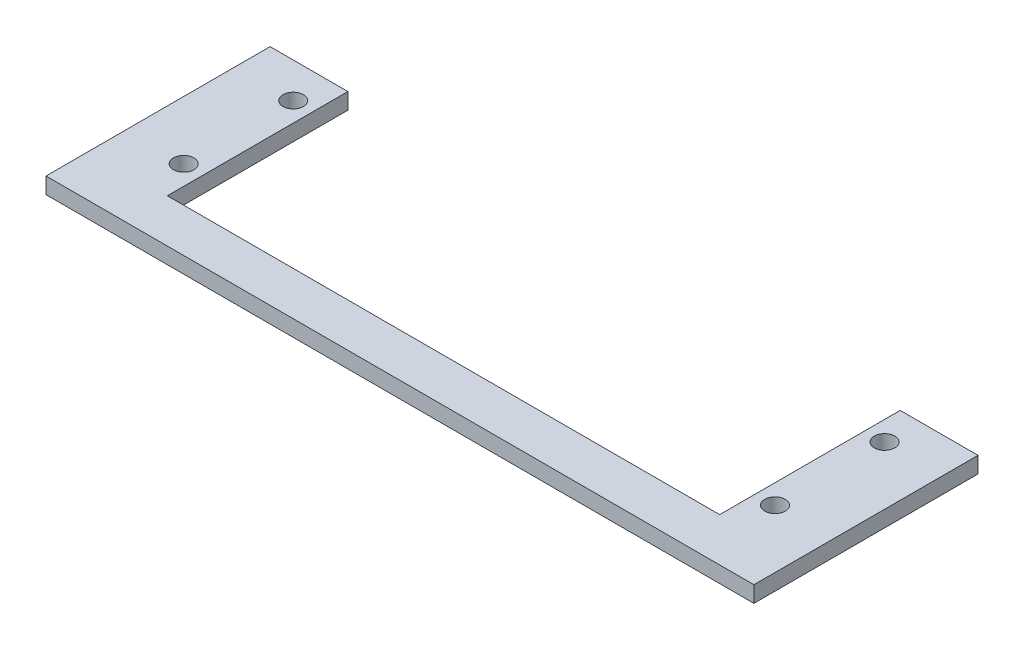
ISO-10303-21;
HEADER;
FILE_DESCRIPTION(('STEP AP214'),'2;1');
FILE_NAME('part.step','',(''),(''),'','','');
FILE_SCHEMA(('AUTOMOTIVE_DESIGN { 1 0 10303 214 1 1 1 1 }'));
ENDSEC;
DATA;
#1=APPLICATION_CONTEXT('core data for automotive mechanical design processes');
#2=APPLICATION_PROTOCOL_DEFINITION('international standard','automotive_design',2000,#1);
#3=PRODUCT_CONTEXT('',#1,'mechanical');
#4=PRODUCT('Part','Part','',(#3));
#5=PRODUCT_RELATED_PRODUCT_CATEGORY('part','',(#4));
#6=PRODUCT_DEFINITION_FORMATION('','',#4);
#7=PRODUCT_DEFINITION_CONTEXT('part definition',#1,'design');
#8=PRODUCT_DEFINITION('design','',#6,#7);
#9=PRODUCT_DEFINITION_SHAPE('','',#8);
#10=(LENGTH_UNIT() NAMED_UNIT(*) SI_UNIT(.MILLI.,.METRE.));
#11=(NAMED_UNIT(*) PLANE_ANGLE_UNIT() SI_UNIT($,.RADIAN.));
#12=(NAMED_UNIT(*) SI_UNIT($,.STERADIAN.) SOLID_ANGLE_UNIT());
#13=UNCERTAINTY_MEASURE_WITH_UNIT(LENGTH_MEASURE(1.E-05),#10,'distance_accuracy_value','');
#14=(GEOMETRIC_REPRESENTATION_CONTEXT(3) GLOBAL_UNCERTAINTY_ASSIGNED_CONTEXT((#13)) GLOBAL_UNIT_ASSIGNED_CONTEXT((#10,
#11,#12)) REPRESENTATION_CONTEXT('',''));
#15=CARTESIAN_POINT('',(0.,0.,0.));
#16=DIRECTION('',(0.,0.,1.));
#17=DIRECTION('',(1.,0.,0.));
#18=AXIS2_PLACEMENT_3D('',#15,#16,#17);
#19=CARTESIAN_POINT('',(0.,2.6,0.));
#20=DIRECTION('',(0.,1.,0.));
#21=DIRECTION('',(0.,0.,1.));
#22=AXIS2_PLACEMENT_3D('',#19,#20,#21);
#23=PLANE('',#22);
#24=CARTESIAN_POINT('',(47.5,2.6,5.64999999999998));
#25=DIRECTION('',(0.,1.,0.));
#26=DIRECTION('',(0.,0.,1.));
#27=AXIS2_PLACEMENT_3D('',#24,#25,#26);
#28=CIRCLE('',#27,1.65);
#29=CARTESIAN_POINT('',(47.5,2.6,7.29999999999999));
#30=VERTEX_POINT('',#29);
#31=EDGE_CURVE('E189',#30,#30,#28,.T.);
#32=ORIENTED_EDGE('',*,*,#31,.F.);
#33=EDGE_LOOP('',(#32));
#34=FACE_BOUND('',#33,.T.);
#35=CARTESIAN_POINT('',(-47.5,2.6,5.65));
#36=DIRECTION('',(0.,1.,0.));
#37=DIRECTION('',(0.,0.,1.));
#38=AXIS2_PLACEMENT_3D('',#35,#36,#37);
#39=CIRCLE('',#38,1.65);
#40=CARTESIAN_POINT('',(-47.5,2.6,7.3));
#41=VERTEX_POINT('',#40);
#42=EDGE_CURVE('E135',#41,#41,#39,.T.);
#43=ORIENTED_EDGE('',*,*,#42,.F.);
#44=EDGE_LOOP('',(#43));
#45=FACE_BOUND('',#44,.T.);
#46=DIRECTION('',(0.,0.,1.));
#47=VECTOR('',#46,1.);
#48=CARTESIAN_POINT('',(44.365,2.6,29.));
#49=LINE('',#48,#47);
#50=CARTESIAN_POINT('',(44.365,2.6,0.));
#51=VERTEX_POINT('',#50);
#52=CARTESIAN_POINT('',(44.365,2.6,29.));
#53=VERTEX_POINT('',#52);
#54=EDGE_CURVE('E146',#51,#53,#49,.T.);
#55=ORIENTED_EDGE('',*,*,#54,.T.);
#56=DIRECTION('',(-1.,0.,0.));
#57=VECTOR('',#56,1.);
#58=CARTESIAN_POINT('',(-44.365,2.6,29.));
#59=LINE('',#58,#57);
#60=CARTESIAN_POINT('',(-44.365,2.6,29.));
#61=VERTEX_POINT('',#60);
#62=EDGE_CURVE('E94',#53,#61,#59,.T.);
#63=ORIENTED_EDGE('',*,*,#62,.T.);
#64=DIRECTION('',(0.,0.,-1.));
#65=VECTOR('',#64,1.);
#66=CARTESIAN_POINT('',(-44.365,2.6,0.));
#67=LINE('',#66,#65);
#68=CARTESIAN_POINT('',(-44.365,2.6,0.));
#69=VERTEX_POINT('',#68);
#70=EDGE_CURVE('E161',#61,#69,#67,.T.);
#71=ORIENTED_EDGE('',*,*,#70,.T.);
#72=DIRECTION('',(-1.,0.,0.));
#73=VECTOR('',#72,1.);
#74=CARTESIAN_POINT('',(-44.365,2.6,0.));
#75=LINE('',#74,#73);
#76=CARTESIAN_POINT('',(-56.865,2.6,0.));
#77=VERTEX_POINT('',#76);
#78=EDGE_CURVE('E174',#69,#77,#75,.T.);
#79=ORIENTED_EDGE('',*,*,#78,.T.);
#80=DIRECTION('',(0.,0.,1.));
#81=VECTOR('',#80,1.);
#82=CARTESIAN_POINT('',(-56.865,2.6,0.));
#83=LINE('',#82,#81);
#84=CARTESIAN_POINT('',(-56.865,2.6,36.));
#85=VERTEX_POINT('',#84);
#86=EDGE_CURVE('E113',#77,#85,#83,.T.);
#87=ORIENTED_EDGE('',*,*,#86,.T.);
#88=DIRECTION('',(1.,0.,0.));
#89=VECTOR('',#88,1.);
#90=CARTESIAN_POINT('',(-56.865,2.6,36.));
#91=LINE('',#90,#89);
#92=CARTESIAN_POINT('',(56.865,2.6,36.));
#93=VERTEX_POINT('',#92);
#94=EDGE_CURVE('E107',#85,#93,#91,.T.);
#95=ORIENTED_EDGE('',*,*,#94,.T.);
#96=DIRECTION('',(0.,0.,-1.));
#97=VECTOR('',#96,1.);
#98=CARTESIAN_POINT('',(56.865,2.6,36.));
#99=LINE('',#98,#97);
#100=CARTESIAN_POINT('',(56.865,2.6,0.));
#101=VERTEX_POINT('',#100);
#102=EDGE_CURVE('E111',#93,#101,#99,.T.);
#103=ORIENTED_EDGE('',*,*,#102,.T.);
#104=DIRECTION('',(-1.,0.,0.));
#105=VECTOR('',#104,1.);
#106=CARTESIAN_POINT('',(56.865,2.6,0.));
#107=LINE('',#106,#105);
#108=EDGE_CURVE('E51',#101,#51,#107,.T.);
#109=ORIENTED_EDGE('',*,*,#108,.T.);
#110=EDGE_LOOP('',(#55,#63,#71,#79,#87,#95,#103,#109));
#111=FACE_BOUND('',#110,.T.);
#112=CARTESIAN_POINT('',(47.5,2.6,23.25));
#113=DIRECTION('',(0.,1.,0.));
#114=DIRECTION('',(0.,0.,1.));
#115=AXIS2_PLACEMENT_3D('',#112,#113,#114);
#116=CIRCLE('',#115,1.65);
#117=CARTESIAN_POINT('',(47.5,2.6,24.9));
#118=VERTEX_POINT('',#117);
#119=EDGE_CURVE('E183',#118,#118,#116,.T.);
#120=ORIENTED_EDGE('',*,*,#119,.F.);
#121=EDGE_LOOP('',(#120));
#122=FACE_BOUND('',#121,.T.);
#123=CARTESIAN_POINT('',(-47.5,2.6,23.25));
#124=DIRECTION('',(0.,1.,0.));
#125=DIRECTION('',(0.,0.,1.));
#126=AXIS2_PLACEMENT_3D('',#123,#124,#125);
#127=CIRCLE('',#126,1.65);
#128=CARTESIAN_POINT('',(-47.5,2.6,24.9));
#129=VERTEX_POINT('',#128);
#130=EDGE_CURVE('E195',#129,#129,#127,.T.);
#131=ORIENTED_EDGE('',*,*,#130,.F.);
#132=EDGE_LOOP('',(#131));
#133=FACE_BOUND('',#132,.T.);
#134=ADVANCED_FACE('F34',(#34,#45,#111,#122,#133),#23,.T.);
#135=CARTESIAN_POINT('',(0.,0.,0.));
#136=DIRECTION('',(0.,1.,0.));
#137=DIRECTION('',(0.,0.,1.));
#138=AXIS2_PLACEMENT_3D('',#135,#136,#137);
#139=PLANE('',#138);
#140=DIRECTION('',(0.,0.,1.));
#141=VECTOR('',#140,1.);
#142=CARTESIAN_POINT('',(44.365,0.,29.));
#143=LINE('',#142,#141);
#144=CARTESIAN_POINT('',(44.365,0.,0.));
#145=VERTEX_POINT('',#144);
#146=CARTESIAN_POINT('',(44.365,0.,29.));
#147=VERTEX_POINT('',#146);
#148=EDGE_CURVE('E131',#145,#147,#143,.T.);
#149=ORIENTED_EDGE('',*,*,#148,.F.);
#150=DIRECTION('',(-1.,0.,0.));
#151=VECTOR('',#150,1.);
#152=CARTESIAN_POINT('',(56.865,0.,0.));
#153=LINE('',#152,#151);
#154=CARTESIAN_POINT('',(56.865,0.,0.));
#155=VERTEX_POINT('',#154);
#156=EDGE_CURVE('E86',#155,#145,#153,.T.);
#157=ORIENTED_EDGE('',*,*,#156,.F.);
#158=DIRECTION('',(0.,0.,-1.));
#159=VECTOR('',#158,1.);
#160=CARTESIAN_POINT('',(56.865,0.,36.));
#161=LINE('',#160,#159);
#162=CARTESIAN_POINT('',(56.865,0.,36.));
#163=VERTEX_POINT('',#162);
#164=EDGE_CURVE('E80',#163,#155,#161,.T.);
#165=ORIENTED_EDGE('',*,*,#164,.F.);
#166=DIRECTION('',(1.,0.,0.));
#167=VECTOR('',#166,1.);
#168=CARTESIAN_POINT('',(-56.865,0.,36.));
#169=LINE('',#168,#167);
#170=CARTESIAN_POINT('',(-56.865,0.,36.));
#171=VERTEX_POINT('',#170);
#172=EDGE_CURVE('E121',#171,#163,#169,.T.);
#173=ORIENTED_EDGE('',*,*,#172,.F.);
#174=DIRECTION('',(0.,0.,1.));
#175=VECTOR('',#174,1.);
#176=CARTESIAN_POINT('',(-56.865,0.,0.));
#177=LINE('',#176,#175);
#178=CARTESIAN_POINT('',(-56.865,0.,0.));
#179=VERTEX_POINT('',#178);
#180=EDGE_CURVE('E141',#179,#171,#177,.T.);
#181=ORIENTED_EDGE('',*,*,#180,.F.);
#182=DIRECTION('',(-1.,0.,0.));
#183=VECTOR('',#182,1.);
#184=CARTESIAN_POINT('',(-44.365,0.,0.));
#185=LINE('',#184,#183);
#186=CARTESIAN_POINT('',(-44.365,0.,0.));
#187=VERTEX_POINT('',#186);
#188=EDGE_CURVE('E139',#187,#179,#185,.T.);
#189=ORIENTED_EDGE('',*,*,#188,.F.);
#190=DIRECTION('',(0.,0.,-1.));
#191=VECTOR('',#190,1.);
#192=CARTESIAN_POINT('',(-44.365,0.,0.));
#193=LINE('',#192,#191);
#194=CARTESIAN_POINT('',(-44.365,0.,29.));
#195=VERTEX_POINT('',#194);
#196=EDGE_CURVE('E137',#195,#187,#193,.T.);
#197=ORIENTED_EDGE('',*,*,#196,.F.);
#198=DIRECTION('',(-1.,0.,0.));
#199=VECTOR('',#198,1.);
#200=CARTESIAN_POINT('',(-44.365,0.,29.));
#201=LINE('',#200,#199);
#202=EDGE_CURVE('E134',#147,#195,#201,.T.);
#203=ORIENTED_EDGE('',*,*,#202,.F.);
#204=EDGE_LOOP('',(#149,#157,#165,#173,#181,#189,#197,#203));
#205=FACE_BOUND('',#204,.T.);
#206=CARTESIAN_POINT('',(-47.5,0.,5.65));
#207=DIRECTION('',(0.,1.,0.));
#208=DIRECTION('',(0.,0.,1.));
#209=AXIS2_PLACEMENT_3D('',#206,#207,#208);
#210=CIRCLE('',#209,1.65);
#211=CARTESIAN_POINT('',(-47.5,0.,7.3));
#212=VERTEX_POINT('',#211);
#213=EDGE_CURVE('E180',#212,#212,#210,.T.);
#214=ORIENTED_EDGE('',*,*,#213,.T.);
#215=EDGE_LOOP('',(#214));
#216=FACE_BOUND('',#215,.T.);
#217=CARTESIAN_POINT('',(47.5,0.,23.25));
#218=DIRECTION('',(0.,1.,0.));
#219=DIRECTION('',(0.,0.,1.));
#220=AXIS2_PLACEMENT_3D('',#217,#218,#219);
#221=CIRCLE('',#220,1.65);
#222=CARTESIAN_POINT('',(47.5,0.,24.9));
#223=VERTEX_POINT('',#222);
#224=EDGE_CURVE('E186',#223,#223,#221,.T.);
#225=ORIENTED_EDGE('',*,*,#224,.T.);
#226=EDGE_LOOP('',(#225));
#227=FACE_BOUND('',#226,.T.);
#228=CARTESIAN_POINT('',(47.5,0.,5.64999999999998));
#229=DIRECTION('',(0.,1.,0.));
#230=DIRECTION('',(0.,0.,1.));
#231=AXIS2_PLACEMENT_3D('',#228,#229,#230);
#232=CIRCLE('',#231,1.65);
#233=CARTESIAN_POINT('',(47.5,0.,7.29999999999999));
#234=VERTEX_POINT('',#233);
#235=EDGE_CURVE('E192',#234,#234,#232,.T.);
#236=ORIENTED_EDGE('',*,*,#235,.T.);
#237=EDGE_LOOP('',(#236));
#238=FACE_BOUND('',#237,.T.);
#239=CARTESIAN_POINT('',(-47.5,0.,23.25));
#240=DIRECTION('',(0.,1.,0.));
#241=DIRECTION('',(0.,0.,1.));
#242=AXIS2_PLACEMENT_3D('',#239,#240,#241);
#243=CIRCLE('',#242,1.65);
#244=CARTESIAN_POINT('',(-47.5,0.,24.9));
#245=VERTEX_POINT('',#244);
#246=EDGE_CURVE('E198',#245,#245,#243,.T.);
#247=ORIENTED_EDGE('',*,*,#246,.T.);
#248=EDGE_LOOP('',(#247));
#249=FACE_BOUND('',#248,.T.);
#250=ADVANCED_FACE('F165',(#205,#216,#227,#238,#249),#139,.F.);
#251=CARTESIAN_POINT('',(44.365,2.6,29.));
#252=DIRECTION('',(1.,0.,0.));
#253=DIRECTION('',(0.,0.,-1.));
#254=AXIS2_PLACEMENT_3D('',#251,#252,#253);
#255=PLANE('',#254);
#256=ORIENTED_EDGE('',*,*,#148,.T.);
#257=DIRECTION('',(0.,-1.,0.));
#258=VECTOR('',#257,1.);
#259=CARTESIAN_POINT('',(44.365,2.6,29.));
#260=LINE('',#259,#258);
#261=EDGE_CURVE('E11',#53,#147,#260,.T.);
#262=ORIENTED_EDGE('',*,*,#261,.F.);
#263=ORIENTED_EDGE('',*,*,#54,.F.);
#264=DIRECTION('',(0.,-1.,0.));
#265=VECTOR('',#264,1.);
#266=CARTESIAN_POINT('',(44.365,2.6,0.));
#267=LINE('',#266,#265);
#268=EDGE_CURVE('E127',#51,#145,#267,.T.);
#269=ORIENTED_EDGE('',*,*,#268,.T.);
#270=EDGE_LOOP('',(#256,#262,#263,#269));
#271=FACE_BOUND('',#270,.T.);
#272=ADVANCED_FACE('F36',(#271),#255,.F.);
#273=CARTESIAN_POINT('',(-44.365,2.6,29.));
#274=DIRECTION('',(0.,0.,1.));
#275=DIRECTION('',(1.,0.,0.));
#276=AXIS2_PLACEMENT_3D('',#273,#274,#275);
#277=PLANE('',#276);
#278=ORIENTED_EDGE('',*,*,#202,.T.);
#279=DIRECTION('',(0.,-1.,0.));
#280=VECTOR('',#279,1.);
#281=CARTESIAN_POINT('',(-44.365,2.6,29.));
#282=LINE('',#281,#280);
#283=EDGE_CURVE('E43',#61,#195,#282,.T.);
#284=ORIENTED_EDGE('',*,*,#283,.F.);
#285=ORIENTED_EDGE('',*,*,#62,.F.);
#286=ORIENTED_EDGE('',*,*,#261,.T.);
#287=EDGE_LOOP('',(#278,#284,#285,#286));
#288=FACE_BOUND('',#287,.T.);
#289=ADVANCED_FACE('F232',(#288),#277,.F.);
#290=CARTESIAN_POINT('',(-44.365,2.6,0.));
#291=DIRECTION('',(-1.,0.,0.));
#292=DIRECTION('',(0.,0.,1.));
#293=AXIS2_PLACEMENT_3D('',#290,#291,#292);
#294=PLANE('',#293);
#295=ORIENTED_EDGE('',*,*,#196,.T.);
#296=DIRECTION('',(0.,-1.,0.));
#297=VECTOR('',#296,1.);
#298=CARTESIAN_POINT('',(-44.365,2.6,0.));
#299=LINE('',#298,#297);
#300=EDGE_CURVE('E153',#69,#187,#299,.T.);
#301=ORIENTED_EDGE('',*,*,#300,.F.);
#302=ORIENTED_EDGE('',*,*,#70,.F.);
#303=ORIENTED_EDGE('',*,*,#283,.T.);
#304=EDGE_LOOP('',(#295,#301,#302,#303));
#305=FACE_BOUND('',#304,.T.);
#306=ADVANCED_FACE('F159',(#305),#294,.F.);
#307=CARTESIAN_POINT('',(-44.365,2.6,0.));
#308=DIRECTION('',(0.,0.,1.));
#309=DIRECTION('',(1.,0.,0.));
#310=AXIS2_PLACEMENT_3D('',#307,#308,#309);
#311=PLANE('',#310);
#312=ORIENTED_EDGE('',*,*,#188,.T.);
#313=DIRECTION('',(0.,-1.,0.));
#314=VECTOR('',#313,1.);
#315=CARTESIAN_POINT('',(-56.865,2.6,0.));
#316=LINE('',#315,#314);
#317=EDGE_CURVE('E150',#77,#179,#316,.T.);
#318=ORIENTED_EDGE('',*,*,#317,.F.);
#319=ORIENTED_EDGE('',*,*,#78,.F.);
#320=ORIENTED_EDGE('',*,*,#300,.T.);
#321=EDGE_LOOP('',(#312,#318,#319,#320));
#322=FACE_BOUND('',#321,.T.);
#323=ADVANCED_FACE('F170',(#322),#311,.F.);
#324=CARTESIAN_POINT('',(-56.865,2.6,0.));
#325=DIRECTION('',(1.,0.,0.));
#326=DIRECTION('',(0.,0.,-1.));
#327=AXIS2_PLACEMENT_3D('',#324,#325,#326);
#328=PLANE('',#327);
#329=ORIENTED_EDGE('',*,*,#180,.T.);
#330=DIRECTION('',(0.,-1.,0.));
#331=VECTOR('',#330,1.);
#332=CARTESIAN_POINT('',(-56.865,2.6,36.));
#333=LINE('',#332,#331);
#334=EDGE_CURVE('E122',#85,#171,#333,.T.);
#335=ORIENTED_EDGE('',*,*,#334,.F.);
#336=ORIENTED_EDGE('',*,*,#86,.F.);
#337=ORIENTED_EDGE('',*,*,#317,.T.);
#338=EDGE_LOOP('',(#329,#335,#336,#337));
#339=FACE_BOUND('',#338,.T.);
#340=ADVANCED_FACE('F173',(#339),#328,.F.);
#341=CARTESIAN_POINT('',(-56.865,2.6,36.));
#342=DIRECTION('',(0.,0.,-1.));
#343=DIRECTION('',(-1.,0.,0.));
#344=AXIS2_PLACEMENT_3D('',#341,#342,#343);
#345=PLANE('',#344);
#346=ORIENTED_EDGE('',*,*,#172,.T.);
#347=DIRECTION('',(0.,-1.,0.));
#348=VECTOR('',#347,1.);
#349=CARTESIAN_POINT('',(56.865,2.6,36.));
#350=LINE('',#349,#348);
#351=EDGE_CURVE('E118',#93,#163,#350,.T.);
#352=ORIENTED_EDGE('',*,*,#351,.F.);
#353=ORIENTED_EDGE('',*,*,#94,.F.);
#354=ORIENTED_EDGE('',*,*,#334,.T.);
#355=EDGE_LOOP('',(#346,#352,#353,#354));
#356=FACE_BOUND('',#355,.T.);
#357=ADVANCED_FACE('F119',(#356),#345,.F.);
#358=CARTESIAN_POINT('',(56.865,2.6,36.));
#359=DIRECTION('',(-1.,0.,0.));
#360=DIRECTION('',(0.,0.,1.));
#361=AXIS2_PLACEMENT_3D('',#358,#359,#360);
#362=PLANE('',#361);
#363=ORIENTED_EDGE('',*,*,#164,.T.);
#364=DIRECTION('',(0.,-1.,0.));
#365=VECTOR('',#364,1.);
#366=CARTESIAN_POINT('',(56.865,2.6,0.));
#367=LINE('',#366,#365);
#368=EDGE_CURVE('E123',#101,#155,#367,.T.);
#369=ORIENTED_EDGE('',*,*,#368,.F.);
#370=ORIENTED_EDGE('',*,*,#102,.F.);
#371=ORIENTED_EDGE('',*,*,#351,.T.);
#372=EDGE_LOOP('',(#363,#369,#370,#371));
#373=FACE_BOUND('',#372,.T.);
#374=ADVANCED_FACE('F125',(#373),#362,.F.);
#375=CARTESIAN_POINT('',(56.865,2.6,0.));
#376=DIRECTION('',(0.,0.,1.));
#377=DIRECTION('',(1.,0.,0.));
#378=AXIS2_PLACEMENT_3D('',#375,#376,#377);
#379=PLANE('',#378);
#380=ORIENTED_EDGE('',*,*,#156,.T.);
#381=ORIENTED_EDGE('',*,*,#268,.F.);
#382=ORIENTED_EDGE('',*,*,#108,.F.);
#383=ORIENTED_EDGE('',*,*,#368,.T.);
#384=EDGE_LOOP('',(#380,#381,#382,#383));
#385=FACE_BOUND('',#384,.T.);
#386=ADVANCED_FACE('F220',(#385),#379,.F.);
#387=CARTESIAN_POINT('',(-47.5,2.6,5.65));
#388=DIRECTION('',(0.,-1.,0.));
#389=DIRECTION('',(0.,0.,-1.));
#390=AXIS2_PLACEMENT_3D('',#387,#388,#389);
#391=CYLINDRICAL_SURFACE('',#390,1.65);
#392=ORIENTED_EDGE('',*,*,#42,.T.);
#393=EDGE_LOOP('',(#392));
#394=FACE_BOUND('',#393,.T.);
#395=ORIENTED_EDGE('',*,*,#213,.F.);
#396=EDGE_LOOP('',(#395));
#397=FACE_BOUND('',#396,.T.);
#398=ADVANCED_FACE('F217',(#394,#397),#391,.F.);
#399=CARTESIAN_POINT('',(47.5,2.6,23.25));
#400=DIRECTION('',(0.,-1.,0.));
#401=DIRECTION('',(0.,0.,-1.));
#402=AXIS2_PLACEMENT_3D('',#399,#400,#401);
#403=CYLINDRICAL_SURFACE('',#402,1.65);
#404=ORIENTED_EDGE('',*,*,#119,.T.);
#405=EDGE_LOOP('',(#404));
#406=FACE_BOUND('',#405,.T.);
#407=ORIENTED_EDGE('',*,*,#224,.F.);
#408=EDGE_LOOP('',(#407));
#409=FACE_BOUND('',#408,.T.);
#410=ADVANCED_FACE('F296',(#406,#409),#403,.F.);
#411=CARTESIAN_POINT('',(47.5,2.6,5.64999999999998));
#412=DIRECTION('',(0.,-1.,0.));
#413=DIRECTION('',(0.,0.,-1.));
#414=AXIS2_PLACEMENT_3D('',#411,#412,#413);
#415=CYLINDRICAL_SURFACE('',#414,1.65);
#416=ORIENTED_EDGE('',*,*,#31,.T.);
#417=EDGE_LOOP('',(#416));
#418=FACE_BOUND('',#417,.T.);
#419=ORIENTED_EDGE('',*,*,#235,.F.);
#420=EDGE_LOOP('',(#419));
#421=FACE_BOUND('',#420,.T.);
#422=ADVANCED_FACE('F304',(#418,#421),#415,.F.);
#423=CARTESIAN_POINT('',(-47.5,2.6,23.25));
#424=DIRECTION('',(0.,-1.,0.));
#425=DIRECTION('',(0.,0.,-1.));
#426=AXIS2_PLACEMENT_3D('',#423,#424,#425);
#427=CYLINDRICAL_SURFACE('',#426,1.65);
#428=ORIENTED_EDGE('',*,*,#130,.T.);
#429=EDGE_LOOP('',(#428));
#430=FACE_BOUND('',#429,.T.);
#431=ORIENTED_EDGE('',*,*,#246,.F.);
#432=EDGE_LOOP('',(#431));
#433=FACE_BOUND('',#432,.T.);
#434=ADVANCED_FACE('F204',(#430,#433),#427,.F.);
#435=CLOSED_SHELL('',(#134,#250,#272,#289,#306,#323,#340,#357,#374,#386,#398,#410,#422,#434));
#436=MANIFOLD_SOLID_BREP('B2',#435);
#437=ADVANCED_BREP_SHAPE_REPRESENTATION('',(#18,#436),#14);
#438=SHAPE_DEFINITION_REPRESENTATION(#9,#437);
ENDSEC;
END-ISO-10303-21;
